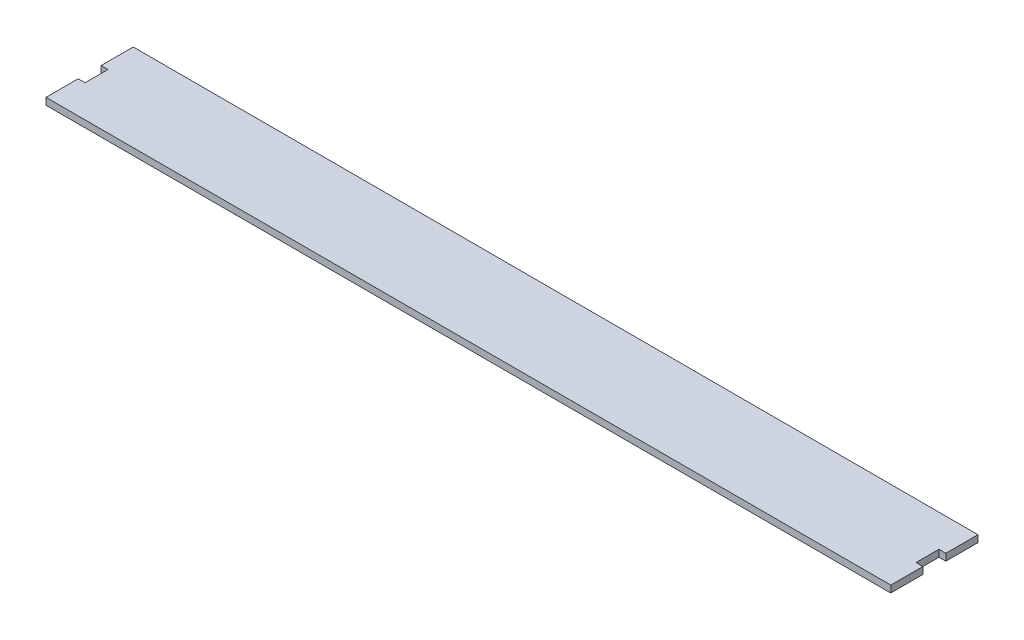
ISO-10303-21;
HEADER;
FILE_DESCRIPTION(('STEP AP214'),'2;1');
FILE_NAME('part.step','',(''),(''),'','','');
FILE_SCHEMA(('AUTOMOTIVE_DESIGN { 1 0 10303 214 1 1 1 1 }'));
ENDSEC;
DATA;
#1=APPLICATION_CONTEXT('core data for automotive mechanical design processes');
#2=APPLICATION_PROTOCOL_DEFINITION('international standard','automotive_design',2000,#1);
#3=PRODUCT_CONTEXT('',#1,'mechanical');
#4=PRODUCT('Part','Part','',(#3));
#5=PRODUCT_RELATED_PRODUCT_CATEGORY('part','',(#4));
#6=PRODUCT_DEFINITION_FORMATION('','',#4);
#7=PRODUCT_DEFINITION_CONTEXT('part definition',#1,'design');
#8=PRODUCT_DEFINITION('design','',#6,#7);
#9=PRODUCT_DEFINITION_SHAPE('','',#8);
#10=(LENGTH_UNIT() NAMED_UNIT(*) SI_UNIT(.MILLI.,.METRE.));
#11=(NAMED_UNIT(*) PLANE_ANGLE_UNIT() SI_UNIT($,.RADIAN.));
#12=(NAMED_UNIT(*) SI_UNIT($,.STERADIAN.) SOLID_ANGLE_UNIT());
#13=UNCERTAINTY_MEASURE_WITH_UNIT(LENGTH_MEASURE(1.E-05),#10,'distance_accuracy_value','');
#14=(GEOMETRIC_REPRESENTATION_CONTEXT(3) GLOBAL_UNCERTAINTY_ASSIGNED_CONTEXT((#13)) GLOBAL_UNIT_ASSIGNED_CONTEXT((#10,
#11,#12)) REPRESENTATION_CONTEXT('',''));
#15=CARTESIAN_POINT('',(0.,0.,0.));
#16=DIRECTION('',(0.,0.,1.));
#17=DIRECTION('',(1.,0.,0.));
#18=AXIS2_PLACEMENT_3D('',#15,#16,#17);
#19=CARTESIAN_POINT('',(-184.,3.,5.));
#20=DIRECTION('',(1.,0.,0.));
#21=DIRECTION('',(0.,0.,-1.));
#22=AXIS2_PLACEMENT_3D('',#19,#20,#21);
#23=PLANE('',#22);
#24=DIRECTION('',(0.,0.,1.));
#25=VECTOR('',#24,1.);
#26=CARTESIAN_POINT('',(-184.,0.,5.));
#27=LINE('',#26,#25);
#28=CARTESIAN_POINT('',(-184.,0.,5.));
#29=VERTEX_POINT('',#28);
#30=CARTESIAN_POINT('',(-184.,0.,19.));
#31=VERTEX_POINT('',#30);
#32=EDGE_CURVE('E157',#29,#31,#27,.T.);
#33=ORIENTED_EDGE('',*,*,#32,.T.);
#34=DIRECTION('',(0.,-1.,0.));
#35=VECTOR('',#34,1.);
#36=CARTESIAN_POINT('',(-184.,3.,19.));
#37=LINE('',#36,#35);
#38=CARTESIAN_POINT('',(-184.,3.,19.));
#39=VERTEX_POINT('',#38);
#40=EDGE_CURVE('E11',#39,#31,#37,.T.);
#41=ORIENTED_EDGE('',*,*,#40,.F.);
#42=DIRECTION('',(0.,0.,1.));
#43=VECTOR('',#42,1.);
#44=CARTESIAN_POINT('',(-184.,3.,5.));
#45=LINE('',#44,#43);
#46=CARTESIAN_POINT('',(-184.,3.,5.));
#47=VERTEX_POINT('',#46);
#48=EDGE_CURVE('E179',#47,#39,#45,.T.);
#49=ORIENTED_EDGE('',*,*,#48,.F.);
#50=DIRECTION('',(0.,-1.,0.));
#51=VECTOR('',#50,1.);
#52=CARTESIAN_POINT('',(-184.,3.,5.));
#53=LINE('',#52,#51);
#54=EDGE_CURVE('E153',#47,#29,#53,.T.);
#55=ORIENTED_EDGE('',*,*,#54,.T.);
#56=EDGE_LOOP('',(#33,#41,#49,#55));
#57=FACE_BOUND('',#56,.T.);
#58=ADVANCED_FACE('F37',(#57),#23,.F.);
#59=CARTESIAN_POINT('',(184.,3.,19.));
#60=DIRECTION('',(0.,0.,-1.));
#61=DIRECTION('',(-1.,0.,0.));
#62=AXIS2_PLACEMENT_3D('',#59,#60,#61);
#63=PLANE('',#62);
#64=DIRECTION('',(1.,0.,0.));
#65=VECTOR('',#64,1.);
#66=CARTESIAN_POINT('',(184.,0.,19.));
#67=LINE('',#66,#65);
#68=CARTESIAN_POINT('',(184.,0.,19.));
#69=VERTEX_POINT('',#68);
#70=EDGE_CURVE('E160',#31,#69,#67,.T.);
#71=ORIENTED_EDGE('',*,*,#70,.T.);
#72=DIRECTION('',(0.,-1.,0.));
#73=VECTOR('',#72,1.);
#74=CARTESIAN_POINT('',(184.,3.,19.));
#75=LINE('',#74,#73);
#76=CARTESIAN_POINT('',(184.,3.,19.));
#77=VERTEX_POINT('',#76);
#78=EDGE_CURVE('E45',#77,#69,#75,.T.);
#79=ORIENTED_EDGE('',*,*,#78,.F.);
#80=DIRECTION('',(1.,0.,0.));
#81=VECTOR('',#80,1.);
#82=CARTESIAN_POINT('',(184.,3.,19.));
#83=LINE('',#82,#81);
#84=EDGE_CURVE('E108',#39,#77,#83,.T.);
#85=ORIENTED_EDGE('',*,*,#84,.F.);
#86=ORIENTED_EDGE('',*,*,#40,.T.);
#87=EDGE_LOOP('',(#71,#79,#85,#86));
#88=FACE_BOUND('',#87,.T.);
#89=ADVANCED_FACE('F257',(#88),#63,.F.);
#90=CARTESIAN_POINT('',(184.,3.,5.));
#91=DIRECTION('',(-1.,0.,0.));
#92=DIRECTION('',(0.,0.,1.));
#93=AXIS2_PLACEMENT_3D('',#90,#91,#92);
#94=PLANE('',#93);
#95=DIRECTION('',(0.,0.,-1.));
#96=VECTOR('',#95,1.);
#97=CARTESIAN_POINT('',(184.,0.,5.));
#98=LINE('',#97,#96);
#99=CARTESIAN_POINT('',(184.,0.,5.));
#100=VERTEX_POINT('',#99);
#101=EDGE_CURVE('E162',#69,#100,#98,.T.);
#102=ORIENTED_EDGE('',*,*,#101,.T.);
#103=DIRECTION('',(0.,-1.,0.));
#104=VECTOR('',#103,1.);
#105=CARTESIAN_POINT('',(184.,3.,5.));
#106=LINE('',#105,#104);
#107=CARTESIAN_POINT('',(184.,3.,5.));
#108=VERTEX_POINT('',#107);
#109=EDGE_CURVE('E198',#108,#100,#106,.T.);
#110=ORIENTED_EDGE('',*,*,#109,.F.);
#111=DIRECTION('',(0.,0.,-1.));
#112=VECTOR('',#111,1.);
#113=CARTESIAN_POINT('',(184.,3.,5.));
#114=LINE('',#113,#112);
#115=EDGE_CURVE('E206',#77,#108,#114,.T.);
#116=ORIENTED_EDGE('',*,*,#115,.F.);
#117=ORIENTED_EDGE('',*,*,#78,.T.);
#118=EDGE_LOOP('',(#102,#110,#116,#117));
#119=FACE_BOUND('',#118,.T.);
#120=ADVANCED_FACE('F204',(#119),#94,.F.);
#121=CARTESIAN_POINT('',(181.,3.,5.));
#122=DIRECTION('',(0.,0.,1.));
#123=DIRECTION('',(1.,0.,0.));
#124=AXIS2_PLACEMENT_3D('',#121,#122,#123);
#125=PLANE('',#124);
#126=DIRECTION('',(-1.,0.,0.));
#127=VECTOR('',#126,1.);
#128=CARTESIAN_POINT('',(181.,0.,5.));
#129=LINE('',#128,#127);
#130=CARTESIAN_POINT('',(181.,0.,5.));
#131=VERTEX_POINT('',#130);
#132=EDGE_CURVE('E164',#100,#131,#129,.T.);
#133=ORIENTED_EDGE('',*,*,#132,.T.);
#134=DIRECTION('',(0.,-1.,0.));
#135=VECTOR('',#134,1.);
#136=CARTESIAN_POINT('',(181.,3.,5.));
#137=LINE('',#136,#135);
#138=CARTESIAN_POINT('',(181.,3.,5.));
#139=VERTEX_POINT('',#138);
#140=EDGE_CURVE('E195',#139,#131,#137,.T.);
#141=ORIENTED_EDGE('',*,*,#140,.F.);
#142=DIRECTION('',(-1.,0.,0.));
#143=VECTOR('',#142,1.);
#144=CARTESIAN_POINT('',(181.,3.,5.));
#145=LINE('',#144,#143);
#146=EDGE_CURVE('E224',#108,#139,#145,.T.);
#147=ORIENTED_EDGE('',*,*,#146,.F.);
#148=ORIENTED_EDGE('',*,*,#109,.T.);
#149=EDGE_LOOP('',(#133,#141,#147,#148));
#150=FACE_BOUND('',#149,.T.);
#151=ADVANCED_FACE('F215',(#150),#125,.F.);
#152=CARTESIAN_POINT('',(181.,3.,-5.));
#153=DIRECTION('',(-1.,0.,0.));
#154=DIRECTION('',(0.,0.,1.));
#155=AXIS2_PLACEMENT_3D('',#152,#153,#154);
#156=PLANE('',#155);
#157=DIRECTION('',(0.,0.,-1.));
#158=VECTOR('',#157,1.);
#159=CARTESIAN_POINT('',(181.,0.,-5.));
#160=LINE('',#159,#158);
#161=CARTESIAN_POINT('',(181.,0.,-5.));
#162=VERTEX_POINT('',#161);
#163=EDGE_CURVE('E166',#131,#162,#160,.T.);
#164=ORIENTED_EDGE('',*,*,#163,.T.);
#165=DIRECTION('',(0.,-1.,0.));
#166=VECTOR('',#165,1.);
#167=CARTESIAN_POINT('',(181.,3.,-5.));
#168=LINE('',#167,#166);
#169=CARTESIAN_POINT('',(181.,3.,-5.));
#170=VERTEX_POINT('',#169);
#171=EDGE_CURVE('E192',#170,#162,#168,.T.);
#172=ORIENTED_EDGE('',*,*,#171,.F.);
#173=DIRECTION('',(0.,0.,-1.));
#174=VECTOR('',#173,1.);
#175=CARTESIAN_POINT('',(181.,3.,-5.));
#176=LINE('',#175,#174);
#177=EDGE_CURVE('E221',#139,#170,#176,.T.);
#178=ORIENTED_EDGE('',*,*,#177,.F.);
#179=ORIENTED_EDGE('',*,*,#140,.T.);
#180=EDGE_LOOP('',(#164,#172,#178,#179));
#181=FACE_BOUND('',#180,.T.);
#182=ADVANCED_FACE('F219',(#181),#156,.F.);
#183=CARTESIAN_POINT('',(181.,3.,-5.));
#184=DIRECTION('',(0.,0.,-1.));
#185=DIRECTION('',(-1.,0.,0.));
#186=AXIS2_PLACEMENT_3D('',#183,#184,#185);
#187=PLANE('',#186);
#188=DIRECTION('',(1.,0.,0.));
#189=VECTOR('',#188,1.);
#190=CARTESIAN_POINT('',(181.,0.,-5.));
#191=LINE('',#190,#189);
#192=CARTESIAN_POINT('',(184.,0.,-5.));
#193=VERTEX_POINT('',#192);
#194=EDGE_CURVE('E168',#162,#193,#191,.T.);
#195=ORIENTED_EDGE('',*,*,#194,.T.);
#196=DIRECTION('',(0.,-1.,0.));
#197=VECTOR('',#196,1.);
#198=CARTESIAN_POINT('',(184.,3.,-5.));
#199=LINE('',#198,#197);
#200=CARTESIAN_POINT('',(184.,3.,-5.));
#201=VERTEX_POINT('',#200);
#202=EDGE_CURVE('E189',#201,#193,#199,.T.);
#203=ORIENTED_EDGE('',*,*,#202,.F.);
#204=DIRECTION('',(1.,0.,0.));
#205=VECTOR('',#204,1.);
#206=CARTESIAN_POINT('',(181.,3.,-5.));
#207=LINE('',#206,#205);
#208=EDGE_CURVE('E223',#170,#201,#207,.T.);
#209=ORIENTED_EDGE('',*,*,#208,.F.);
#210=ORIENTED_EDGE('',*,*,#171,.T.);
#211=EDGE_LOOP('',(#195,#203,#209,#210));
#212=FACE_BOUND('',#211,.T.);
#213=ADVANCED_FACE('F270',(#212),#187,.F.);
#214=CARTESIAN_POINT('',(184.,3.,-19.));
#215=DIRECTION('',(-1.,0.,0.));
#216=DIRECTION('',(0.,0.,1.));
#217=AXIS2_PLACEMENT_3D('',#214,#215,#216);
#218=PLANE('',#217);
#219=DIRECTION('',(0.,0.,-1.));
#220=VECTOR('',#219,1.);
#221=CARTESIAN_POINT('',(184.,0.,-19.));
#222=LINE('',#221,#220);
#223=CARTESIAN_POINT('',(184.,0.,-19.));
#224=VERTEX_POINT('',#223);
#225=EDGE_CURVE('E170',#193,#224,#222,.T.);
#226=ORIENTED_EDGE('',*,*,#225,.T.);
#227=DIRECTION('',(0.,-1.,0.));
#228=VECTOR('',#227,1.);
#229=CARTESIAN_POINT('',(184.,3.,-19.));
#230=LINE('',#229,#228);
#231=CARTESIAN_POINT('',(184.,3.,-19.));
#232=VERTEX_POINT('',#231);
#233=EDGE_CURVE('E186',#232,#224,#230,.T.);
#234=ORIENTED_EDGE('',*,*,#233,.F.);
#235=DIRECTION('',(0.,0.,-1.));
#236=VECTOR('',#235,1.);
#237=CARTESIAN_POINT('',(184.,3.,-19.));
#238=LINE('',#237,#236);
#239=EDGE_CURVE('E226',#201,#232,#238,.T.);
#240=ORIENTED_EDGE('',*,*,#239,.F.);
#241=ORIENTED_EDGE('',*,*,#202,.T.);
#242=EDGE_LOOP('',(#226,#234,#240,#241));
#243=FACE_BOUND('',#242,.T.);
#244=ADVANCED_FACE('F273',(#243),#218,.F.);
#245=CARTESIAN_POINT('',(184.,3.,-19.));
#246=DIRECTION('',(0.,0.,1.));
#247=DIRECTION('',(1.,0.,0.));
#248=AXIS2_PLACEMENT_3D('',#245,#246,#247);
#249=PLANE('',#248);
#250=DIRECTION('',(-1.,0.,0.));
#251=VECTOR('',#250,1.);
#252=CARTESIAN_POINT('',(184.,0.,-19.));
#253=LINE('',#252,#251);
#254=CARTESIAN_POINT('',(-184.,0.,-19.));
#255=VERTEX_POINT('',#254);
#256=EDGE_CURVE('E172',#224,#255,#253,.T.);
#257=ORIENTED_EDGE('',*,*,#256,.T.);
#258=DIRECTION('',(0.,-1.,0.));
#259=VECTOR('',#258,1.);
#260=CARTESIAN_POINT('',(-184.,3.,-19.));
#261=LINE('',#260,#259);
#262=CARTESIAN_POINT('',(-184.,3.,-19.));
#263=VERTEX_POINT('',#262);
#264=EDGE_CURVE('E183',#263,#255,#261,.T.);
#265=ORIENTED_EDGE('',*,*,#264,.F.);
#266=DIRECTION('',(-1.,0.,0.));
#267=VECTOR('',#266,1.);
#268=CARTESIAN_POINT('',(184.,3.,-19.));
#269=LINE('',#268,#267);
#270=EDGE_CURVE('E232',#232,#263,#269,.T.);
#271=ORIENTED_EDGE('',*,*,#270,.F.);
#272=ORIENTED_EDGE('',*,*,#233,.T.);
#273=EDGE_LOOP('',(#257,#265,#271,#272));
#274=FACE_BOUND('',#273,.T.);
#275=ADVANCED_FACE('F238',(#274),#249,.F.);
#276=CARTESIAN_POINT('',(-184.,3.,-19.));
#277=DIRECTION('',(1.,0.,0.));
#278=DIRECTION('',(0.,0.,-1.));
#279=AXIS2_PLACEMENT_3D('',#276,#277,#278);
#280=PLANE('',#279);
#281=DIRECTION('',(0.,0.,1.));
#282=VECTOR('',#281,1.);
#283=CARTESIAN_POINT('',(-184.,0.,-19.));
#284=LINE('',#283,#282);
#285=CARTESIAN_POINT('',(-184.,0.,-5.));
#286=VERTEX_POINT('',#285);
#287=EDGE_CURVE('E174',#255,#286,#284,.T.);
#288=ORIENTED_EDGE('',*,*,#287,.T.);
#289=DIRECTION('',(0.,-1.,0.));
#290=VECTOR('',#289,1.);
#291=CARTESIAN_POINT('',(-184.,3.,-5.));
#292=LINE('',#291,#290);
#293=CARTESIAN_POINT('',(-184.,3.,-5.));
#294=VERTEX_POINT('',#293);
#295=EDGE_CURVE('E148',#294,#286,#292,.T.);
#296=ORIENTED_EDGE('',*,*,#295,.F.);
#297=DIRECTION('',(0.,0.,1.));
#298=VECTOR('',#297,1.);
#299=CARTESIAN_POINT('',(-184.,3.,-19.));
#300=LINE('',#299,#298);
#301=EDGE_CURVE('E139',#263,#294,#300,.T.);
#302=ORIENTED_EDGE('',*,*,#301,.F.);
#303=ORIENTED_EDGE('',*,*,#264,.T.);
#304=EDGE_LOOP('',(#288,#296,#302,#303));
#305=FACE_BOUND('',#304,.T.);
#306=ADVANCED_FACE('F242',(#305),#280,.F.);
#307=CARTESIAN_POINT('',(-181.,3.,-5.));
#308=DIRECTION('',(0.,0.,-1.));
#309=DIRECTION('',(-1.,0.,0.));
#310=AXIS2_PLACEMENT_3D('',#307,#308,#309);
#311=PLANE('',#310);
#312=DIRECTION('',(1.,0.,0.));
#313=VECTOR('',#312,1.);
#314=CARTESIAN_POINT('',(-181.,0.,-5.));
#315=LINE('',#314,#313);
#316=CARTESIAN_POINT('',(-181.,0.,-5.));
#317=VERTEX_POINT('',#316);
#318=EDGE_CURVE('E147',#286,#317,#315,.T.);
#319=ORIENTED_EDGE('',*,*,#318,.T.);
#320=DIRECTION('',(0.,-1.,0.));
#321=VECTOR('',#320,1.);
#322=CARTESIAN_POINT('',(-181.,3.,-5.));
#323=LINE('',#322,#321);
#324=CARTESIAN_POINT('',(-181.,3.,-5.));
#325=VERTEX_POINT('',#324);
#326=EDGE_CURVE('E144',#325,#317,#323,.T.);
#327=ORIENTED_EDGE('',*,*,#326,.F.);
#328=DIRECTION('',(1.,0.,0.));
#329=VECTOR('',#328,1.);
#330=CARTESIAN_POINT('',(-181.,3.,-5.));
#331=LINE('',#330,#329);
#332=EDGE_CURVE('E133',#294,#325,#331,.T.);
#333=ORIENTED_EDGE('',*,*,#332,.F.);
#334=ORIENTED_EDGE('',*,*,#295,.T.);
#335=EDGE_LOOP('',(#319,#327,#333,#334));
#336=FACE_BOUND('',#335,.T.);
#337=ADVANCED_FACE('F145',(#336),#311,.F.);
#338=CARTESIAN_POINT('',(-181.,3.,-5.));
#339=DIRECTION('',(1.,0.,0.));
#340=DIRECTION('',(0.,0.,-1.));
#341=AXIS2_PLACEMENT_3D('',#338,#339,#340);
#342=PLANE('',#341);
#343=DIRECTION('',(0.,0.,1.));
#344=VECTOR('',#343,1.);
#345=CARTESIAN_POINT('',(-181.,0.,-5.));
#346=LINE('',#345,#344);
#347=CARTESIAN_POINT('',(-181.,0.,5.));
#348=VERTEX_POINT('',#347);
#349=EDGE_CURVE('E94',#317,#348,#346,.T.);
#350=ORIENTED_EDGE('',*,*,#349,.T.);
#351=DIRECTION('',(0.,-1.,0.));
#352=VECTOR('',#351,1.);
#353=CARTESIAN_POINT('',(-181.,3.,5.));
#354=LINE('',#353,#352);
#355=CARTESIAN_POINT('',(-181.,3.,5.));
#356=VERTEX_POINT('',#355);
#357=EDGE_CURVE('E149',#356,#348,#354,.T.);
#358=ORIENTED_EDGE('',*,*,#357,.F.);
#359=DIRECTION('',(0.,0.,1.));
#360=VECTOR('',#359,1.);
#361=CARTESIAN_POINT('',(-181.,3.,-5.));
#362=LINE('',#361,#360);
#363=EDGE_CURVE('E137',#325,#356,#362,.T.);
#364=ORIENTED_EDGE('',*,*,#363,.F.);
#365=ORIENTED_EDGE('',*,*,#326,.T.);
#366=EDGE_LOOP('',(#350,#358,#364,#365));
#367=FACE_BOUND('',#366,.T.);
#368=ADVANCED_FACE('F151',(#367),#342,.F.);
#369=CARTESIAN_POINT('',(-181.,3.,5.));
#370=DIRECTION('',(0.,0.,1.));
#371=DIRECTION('',(1.,0.,0.));
#372=AXIS2_PLACEMENT_3D('',#369,#370,#371);
#373=PLANE('',#372);
#374=DIRECTION('',(-1.,0.,0.));
#375=VECTOR('',#374,1.);
#376=CARTESIAN_POINT('',(-181.,0.,5.));
#377=LINE('',#376,#375);
#378=EDGE_CURVE('E100',#348,#29,#377,.T.);
#379=ORIENTED_EDGE('',*,*,#378,.T.);
#380=ORIENTED_EDGE('',*,*,#54,.F.);
#381=DIRECTION('',(-1.,0.,0.));
#382=VECTOR('',#381,1.);
#383=CARTESIAN_POINT('',(-181.,3.,5.));
#384=LINE('',#383,#382);
#385=EDGE_CURVE('E53',#356,#47,#384,.T.);
#386=ORIENTED_EDGE('',*,*,#385,.F.);
#387=ORIENTED_EDGE('',*,*,#357,.T.);
#388=EDGE_LOOP('',(#379,#380,#386,#387));
#389=FACE_BOUND('',#388,.T.);
#390=ADVANCED_FACE('F246',(#389),#373,.F.);
#391=CARTESIAN_POINT('',(0.,3.,0.));
#392=DIRECTION('',(0.,-1.,0.));
#393=DIRECTION('',(0.,0.,-1.));
#394=AXIS2_PLACEMENT_3D('',#391,#392,#393);
#395=PLANE('',#394);
#396=ORIENTED_EDGE('',*,*,#48,.T.);
#397=ORIENTED_EDGE('',*,*,#84,.T.);
#398=ORIENTED_EDGE('',*,*,#115,.T.);
#399=ORIENTED_EDGE('',*,*,#146,.T.);
#400=ORIENTED_EDGE('',*,*,#177,.T.);
#401=ORIENTED_EDGE('',*,*,#208,.T.);
#402=ORIENTED_EDGE('',*,*,#239,.T.);
#403=ORIENTED_EDGE('',*,*,#270,.T.);
#404=ORIENTED_EDGE('',*,*,#301,.T.);
#405=ORIENTED_EDGE('',*,*,#332,.T.);
#406=ORIENTED_EDGE('',*,*,#363,.T.);
#407=ORIENTED_EDGE('',*,*,#385,.T.);
#408=EDGE_LOOP('',(#396,#397,#398,#399,#400,#401,#402,#403,#404,#405,#406,#407));
#409=FACE_BOUND('',#408,.T.);
#410=ADVANCED_FACE('F135',(#409),#395,.F.);
#411=CARTESIAN_POINT('',(0.,0.,0.));
#412=DIRECTION('',(0.,-1.,0.));
#413=DIRECTION('',(0.,0.,-1.));
#414=AXIS2_PLACEMENT_3D('',#411,#412,#413);
#415=PLANE('',#414);
#416=ORIENTED_EDGE('',*,*,#32,.F.);
#417=ORIENTED_EDGE('',*,*,#378,.F.);
#418=ORIENTED_EDGE('',*,*,#349,.F.);
#419=ORIENTED_EDGE('',*,*,#318,.F.);
#420=ORIENTED_EDGE('',*,*,#287,.F.);
#421=ORIENTED_EDGE('',*,*,#256,.F.);
#422=ORIENTED_EDGE('',*,*,#225,.F.);
#423=ORIENTED_EDGE('',*,*,#194,.F.);
#424=ORIENTED_EDGE('',*,*,#163,.F.);
#425=ORIENTED_EDGE('',*,*,#132,.F.);
#426=ORIENTED_EDGE('',*,*,#101,.F.);
#427=ORIENTED_EDGE('',*,*,#70,.F.);
#428=EDGE_LOOP('',(#416,#417,#418,#419,#420,#421,#422,#423,#424,#425,#426,#427));
#429=FACE_BOUND('',#428,.T.);
#430=ADVANCED_FACE('F210',(#429),#415,.T.);
#431=CLOSED_SHELL('',(#58,#89,#120,#151,#182,#213,#244,#275,#306,#337,#368,#390,#410,#430));
#432=MANIFOLD_SOLID_BREP('B2',#431);
#433=ADVANCED_BREP_SHAPE_REPRESENTATION('',(#18,#432),#14);
#434=SHAPE_DEFINITION_REPRESENTATION(#9,#433);
ENDSEC;
END-ISO-10303-21;
